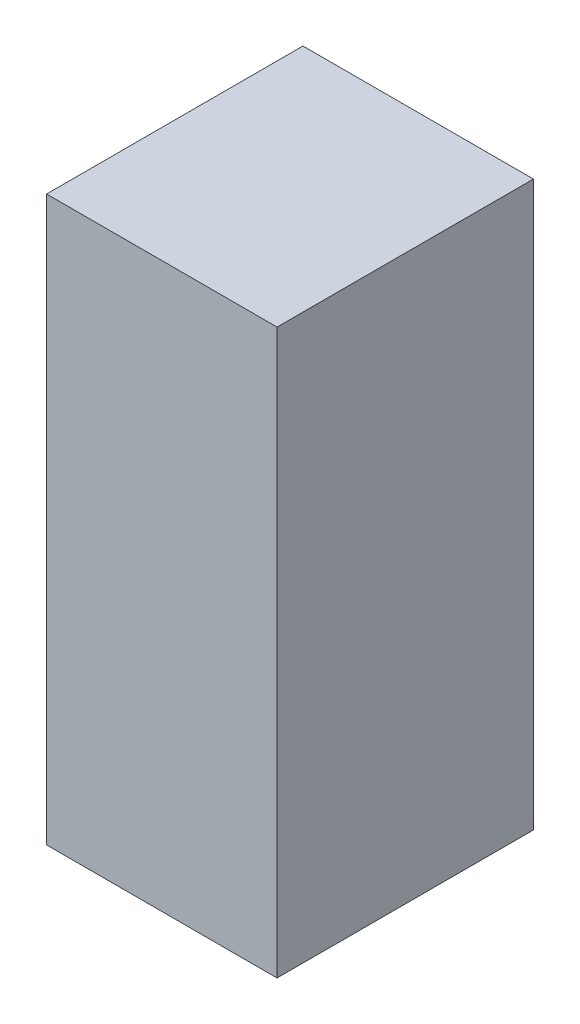
ISO-10303-21;
HEADER;
FILE_DESCRIPTION(('STEP AP214'),'2;1');
FILE_NAME('part.step','',(''),(''),'','','');
FILE_SCHEMA(('AUTOMOTIVE_DESIGN { 1 0 10303 214 1 1 1 1 }'));
ENDSEC;
DATA;
#1=APPLICATION_CONTEXT('core data for automotive mechanical design processes');
#2=APPLICATION_PROTOCOL_DEFINITION('international standard','automotive_design',2000,#1);
#3=PRODUCT_CONTEXT('',#1,'mechanical');
#4=PRODUCT('Part','Part','',(#3));
#5=PRODUCT_RELATED_PRODUCT_CATEGORY('part','',(#4));
#6=PRODUCT_DEFINITION_FORMATION('','',#4);
#7=PRODUCT_DEFINITION_CONTEXT('part definition',#1,'design');
#8=PRODUCT_DEFINITION('design','',#6,#7);
#9=PRODUCT_DEFINITION_SHAPE('','',#8);
#10=(LENGTH_UNIT() NAMED_UNIT(*) SI_UNIT(.MILLI.,.METRE.));
#11=(NAMED_UNIT(*) PLANE_ANGLE_UNIT() SI_UNIT($,.RADIAN.));
#12=(NAMED_UNIT(*) SI_UNIT($,.STERADIAN.) SOLID_ANGLE_UNIT());
#13=UNCERTAINTY_MEASURE_WITH_UNIT(LENGTH_MEASURE(1.E-05),#10,'distance_accuracy_value','');
#14=(GEOMETRIC_REPRESENTATION_CONTEXT(3) GLOBAL_UNCERTAINTY_ASSIGNED_CONTEXT((#13)) GLOBAL_UNIT_ASSIGNED_CONTEXT((#10,
#11,#12)) REPRESENTATION_CONTEXT('',''));
#15=CARTESIAN_POINT('',(0.,0.,0.));
#16=DIRECTION('',(0.,0.,1.));
#17=DIRECTION('',(1.,0.,0.));
#18=AXIS2_PLACEMENT_3D('',#15,#16,#17);
#19=CARTESIAN_POINT('',(0.4494911,-1.0994898,0.));
#20=DIRECTION('',(-1.,0.,0.));
#21=DIRECTION('',(0.,0.,1.));
#22=AXIS2_PLACEMENT_3D('',#19,#20,#21);
#23=PLANE('',#22);
#24=DIRECTION('',(0.,1.,0.));
#25=VECTOR('',#24,1.);
#26=CARTESIAN_POINT('',(0.4494911,1.09949234,0.));
#27=LINE('',#26,#25);
#28=CARTESIAN_POINT('',(0.4494911,1.09949234,0.));
#29=VERTEX_POINT('',#28);
#30=CARTESIAN_POINT('',(0.4494911,-1.0994898,0.));
#31=VERTEX_POINT('',#30);
#32=EDGE_CURVE('E53',#29,#31,#27,.F.);
#33=ORIENTED_EDGE('',*,*,#32,.F.);
#34=DIRECTION('',(0.,0.,1.));
#35=VECTOR('',#34,1.);
#36=CARTESIAN_POINT('',(0.4494911,1.09949234,0.));
#37=LINE('',#36,#35);
#38=CARTESIAN_POINT('',(0.4494911,1.09949234,1.00000054));
#39=VERTEX_POINT('',#38);
#40=EDGE_CURVE('E20',#39,#29,#37,.F.);
#41=ORIENTED_EDGE('',*,*,#40,.F.);
#42=DIRECTION('',(0.,1.,0.));
#43=VECTOR('',#42,1.);
#44=CARTESIAN_POINT('',(0.4494911,1.09949234,1.00000054));
#45=LINE('',#44,#43);
#46=CARTESIAN_POINT('',(0.4494911,-1.0994898,1.00000054));
#47=VERTEX_POINT('',#46);
#48=EDGE_CURVE('E58',#39,#47,#45,.F.);
#49=ORIENTED_EDGE('',*,*,#48,.T.);
#50=DIRECTION('',(0.,0.,1.));
#51=VECTOR('',#50,1.);
#52=CARTESIAN_POINT('',(0.4494911,-1.0994898,0.));
#53=LINE('',#52,#51);
#54=EDGE_CURVE('E60',#47,#31,#53,.F.);
#55=ORIENTED_EDGE('',*,*,#54,.T.);
#56=EDGE_LOOP('',(#33,#41,#49,#55));
#57=FACE_BOUND('',#56,.T.);
#58=ADVANCED_FACE('F17',(#57),#23,.F.);
#59=CARTESIAN_POINT('',(0.4494911,1.09949234,1.00000054));
#60=DIRECTION('',(0.,0.,-1.));
#61=DIRECTION('',(-1.,0.,0.));
#62=AXIS2_PLACEMENT_3D('',#59,#60,#61);
#63=PLANE('',#62);
#64=DIRECTION('',(0.,1.,0.));
#65=VECTOR('',#64,1.);
#66=CARTESIAN_POINT('',(-0.4494911,1.09949234,1.00000054));
#67=LINE('',#66,#65);
#68=CARTESIAN_POINT('',(-0.4494911,1.09949234,1.00000054));
#69=VERTEX_POINT('',#68);
#70=CARTESIAN_POINT('',(-0.4494911,-1.0994898,1.00000054));
#71=VERTEX_POINT('',#70);
#72=EDGE_CURVE('E75',#69,#71,#67,.F.);
#73=ORIENTED_EDGE('',*,*,#72,.T.);
#74=DIRECTION('',(1.,0.,0.));
#75=VECTOR('',#74,1.);
#76=CARTESIAN_POINT('',(-0.4494911,-1.0994898,1.00000054));
#77=LINE('',#76,#75);
#78=EDGE_CURVE('E66',#71,#47,#77,.T.);
#79=ORIENTED_EDGE('',*,*,#78,.T.);
#80=ORIENTED_EDGE('',*,*,#48,.F.);
#81=DIRECTION('',(1.,0.,0.));
#82=VECTOR('',#81,1.);
#83=CARTESIAN_POINT('',(0.4494911,1.09949234,1.00000054));
#84=LINE('',#83,#82);
#85=EDGE_CURVE('E80',#39,#69,#84,.F.);
#86=ORIENTED_EDGE('',*,*,#85,.T.);
#87=EDGE_LOOP('',(#73,#79,#80,#86));
#88=FACE_BOUND('',#87,.T.);
#89=ADVANCED_FACE('F74',(#88),#63,.F.);
#90=CARTESIAN_POINT('',(-0.4494911,-1.0994898,0.));
#91=DIRECTION('',(0.,1.,0.));
#92=DIRECTION('',(0.,0.,1.));
#93=AXIS2_PLACEMENT_3D('',#90,#91,#92);
#94=PLANE('',#93);
#95=DIRECTION('',(-1.,0.,0.));
#96=VECTOR('',#95,1.);
#97=CARTESIAN_POINT('',(0.4494911,-1.0994898,0.));
#98=LINE('',#97,#96);
#99=CARTESIAN_POINT('',(-0.4494911,-1.0994898,0.));
#100=VERTEX_POINT('',#99);
#101=EDGE_CURVE('E71',#31,#100,#98,.T.);
#102=ORIENTED_EDGE('',*,*,#101,.F.);
#103=ORIENTED_EDGE('',*,*,#54,.F.);
#104=ORIENTED_EDGE('',*,*,#78,.F.);
#105=DIRECTION('',(0.,0.,-1.));
#106=VECTOR('',#105,1.);
#107=CARTESIAN_POINT('',(-0.4494911,-1.0994898,0.));
#108=LINE('',#107,#106);
#109=EDGE_CURVE('E84',#71,#100,#108,.T.);
#110=ORIENTED_EDGE('',*,*,#109,.T.);
#111=EDGE_LOOP('',(#102,#103,#104,#110));
#112=FACE_BOUND('',#111,.T.);
#113=ADVANCED_FACE('F68',(#112),#94,.F.);
#114=CARTESIAN_POINT('',(0.4494911,1.09949234,0.));
#115=DIRECTION('',(0.,0.,-1.));
#116=DIRECTION('',(-1.,0.,0.));
#117=AXIS2_PLACEMENT_3D('',#114,#115,#116);
#118=PLANE('',#117);
#119=ORIENTED_EDGE('',*,*,#101,.T.);
#120=DIRECTION('',(0.,1.,0.));
#121=VECTOR('',#120,1.);
#122=CARTESIAN_POINT('',(-0.4494911,1.09949234,0.));
#123=LINE('',#122,#121);
#124=CARTESIAN_POINT('',(-0.4494911,1.09949234,0.));
#125=VERTEX_POINT('',#124);
#126=EDGE_CURVE('E26',#100,#125,#123,.T.);
#127=ORIENTED_EDGE('',*,*,#126,.T.);
#128=DIRECTION('',(1.,0.,0.));
#129=VECTOR('',#128,1.);
#130=CARTESIAN_POINT('',(0.4494911,1.09949234,0.));
#131=LINE('',#130,#129);
#132=EDGE_CURVE('E34',#125,#29,#131,.T.);
#133=ORIENTED_EDGE('',*,*,#132,.T.);
#134=ORIENTED_EDGE('',*,*,#32,.T.);
#135=EDGE_LOOP('',(#119,#127,#133,#134));
#136=FACE_BOUND('',#135,.T.);
#137=ADVANCED_FACE('F88',(#136),#118,.T.);
#138=CARTESIAN_POINT('',(0.4494911,1.09949234,0.));
#139=DIRECTION('',(0.,-1.,0.));
#140=DIRECTION('',(0.,0.,-1.));
#141=AXIS2_PLACEMENT_3D('',#138,#139,#140);
#142=PLANE('',#141);
#143=ORIENTED_EDGE('',*,*,#132,.F.);
#144=DIRECTION('',(0.,0.,-1.));
#145=VECTOR('',#144,1.);
#146=CARTESIAN_POINT('',(-0.4494911,1.09949234,0.));
#147=LINE('',#146,#145);
#148=EDGE_CURVE('E11',#125,#69,#147,.F.);
#149=ORIENTED_EDGE('',*,*,#148,.T.);
#150=ORIENTED_EDGE('',*,*,#85,.F.);
#151=ORIENTED_EDGE('',*,*,#40,.T.);
#152=EDGE_LOOP('',(#143,#149,#150,#151));
#153=FACE_BOUND('',#152,.T.);
#154=ADVANCED_FACE('F91',(#153),#142,.F.);
#155=CARTESIAN_POINT('',(-0.4494911,1.09949234,0.));
#156=DIRECTION('',(1.,0.,0.));
#157=DIRECTION('',(0.,0.,-1.));
#158=AXIS2_PLACEMENT_3D('',#155,#156,#157);
#159=PLANE('',#158);
#160=ORIENTED_EDGE('',*,*,#126,.F.);
#161=ORIENTED_EDGE('',*,*,#109,.F.);
#162=ORIENTED_EDGE('',*,*,#72,.F.);
#163=ORIENTED_EDGE('',*,*,#148,.F.);
#164=EDGE_LOOP('',(#160,#161,#162,#163));
#165=FACE_BOUND('',#164,.T.);
#166=ADVANCED_FACE('F90',(#165),#159,.F.);
#167=CLOSED_SHELL('',(#58,#89,#113,#137,#154,#166));
#168=MANIFOLD_SOLID_BREP('B1',#167);
#169=ADVANCED_BREP_SHAPE_REPRESENTATION('',(#18,#168),#14);
#170=SHAPE_DEFINITION_REPRESENTATION(#9,#169);
ENDSEC;
END-ISO-10303-21;
